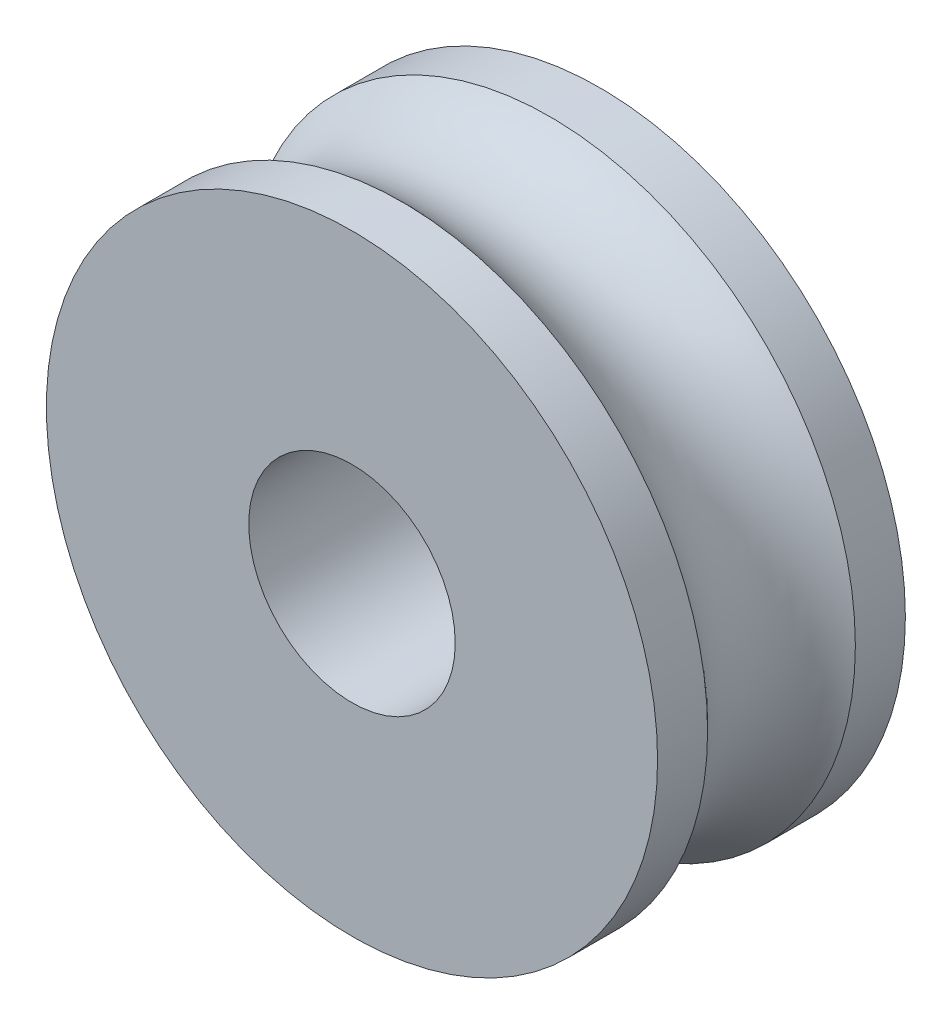
ISO-10303-21;
HEADER;
FILE_DESCRIPTION(('STEP AP214'),'2;1');
FILE_NAME('part.step','',(''),(''),'','','');
FILE_SCHEMA(('AUTOMOTIVE_DESIGN { 1 0 10303 214 1 1 1 1 }'));
ENDSEC;
DATA;
#1=APPLICATION_CONTEXT('core data for automotive mechanical design processes');
#2=APPLICATION_PROTOCOL_DEFINITION('international standard','automotive_design',2000,#1);
#3=PRODUCT_CONTEXT('',#1,'mechanical');
#4=PRODUCT('Part','Part','',(#3));
#5=PRODUCT_RELATED_PRODUCT_CATEGORY('part','',(#4));
#6=PRODUCT_DEFINITION_FORMATION('','',#4);
#7=PRODUCT_DEFINITION_CONTEXT('part definition',#1,'design');
#8=PRODUCT_DEFINITION('design','',#6,#7);
#9=PRODUCT_DEFINITION_SHAPE('','',#8);
#10=(LENGTH_UNIT() NAMED_UNIT(*) SI_UNIT(.MILLI.,.METRE.));
#11=(NAMED_UNIT(*) PLANE_ANGLE_UNIT() SI_UNIT($,.RADIAN.));
#12=(NAMED_UNIT(*) SI_UNIT($,.STERADIAN.) SOLID_ANGLE_UNIT());
#13=UNCERTAINTY_MEASURE_WITH_UNIT(LENGTH_MEASURE(1.E-05),#10,'distance_accuracy_value','');
#14=(GEOMETRIC_REPRESENTATION_CONTEXT(3) GLOBAL_UNCERTAINTY_ASSIGNED_CONTEXT((#13)) GLOBAL_UNIT_ASSIGNED_CONTEXT((#10,
#11,#12)) REPRESENTATION_CONTEXT('',''));
#15=CARTESIAN_POINT('',(0.,0.,0.));
#16=DIRECTION('',(0.,0.,1.));
#17=DIRECTION('',(1.,0.,0.));
#18=AXIS2_PLACEMENT_3D('',#15,#16,#17);
#19=CARTESIAN_POINT('',(0.,0.,0.));
#20=DIRECTION('',(0.,0.,1.));
#21=DIRECTION('',(1.,0.,0.));
#22=AXIS2_PLACEMENT_3D('',#19,#20,#21);
#23=CYLINDRICAL_SURFACE('',#22,37.);
#24=CARTESIAN_POINT('',(0.,0.,15.));
#25=DIRECTION('',(0.,0.,1.));
#26=DIRECTION('',(1.,0.,0.));
#27=AXIS2_PLACEMENT_3D('',#24,#25,#26);
#28=CIRCLE('',#27,37.);
#29=CARTESIAN_POINT('',(37.,0.,15.));
#30=VERTEX_POINT('',#29);
#31=EDGE_CURVE('E59',#30,#30,#28,.T.);
#32=ORIENTED_EDGE('',*,*,#31,.F.);
#33=EDGE_LOOP('',(#32));
#34=FACE_BOUND('',#33,.T.);
#35=CARTESIAN_POINT('',(0.,0.,8.94427190999915));
#36=DIRECTION('',(0.,0.,1.));
#37=DIRECTION('',(1.,0.,0.));
#38=AXIS2_PLACEMENT_3D('',#35,#36,#37);
#39=CIRCLE('',#38,37.);
#40=CARTESIAN_POINT('',(37.,0.,8.94427190999915));
#41=VERTEX_POINT('',#40);
#42=EDGE_CURVE('E10',#41,#41,#39,.T.);
#43=ORIENTED_EDGE('',*,*,#42,.T.);
#44=EDGE_LOOP('',(#43));
#45=FACE_BOUND('',#44,.T.);
#46=ADVANCED_FACE('F37',(#34,#45),#23,.T.);
#47=CARTESIAN_POINT('',(0.,0.,0.));
#48=DIRECTION('',(0.,0.,1.));
#49=DIRECTION('',(1.,0.,0.));
#50=AXIS2_PLACEMENT_3D('',#47,#48,#49);
#51=TOROIDAL_SURFACE('',#50,45.,12.);
#52=ORIENTED_EDGE('',*,*,#42,.F.);
#53=EDGE_LOOP('',(#52));
#54=FACE_BOUND('',#53,.T.);
#55=CARTESIAN_POINT('',(0.,0.,-8.94427190999915));
#56=DIRECTION('',(0.,0.,1.));
#57=DIRECTION('',(1.,0.,0.));
#58=AXIS2_PLACEMENT_3D('',#55,#56,#57);
#59=CIRCLE('',#58,37.);
#60=CARTESIAN_POINT('',(37.,0.,-8.94427190999915));
#61=VERTEX_POINT('',#60);
#62=EDGE_CURVE('E43',#61,#61,#59,.T.);
#63=ORIENTED_EDGE('',*,*,#62,.T.);
#64=EDGE_LOOP('',(#63));
#65=FACE_BOUND('',#64,.T.);
#66=ADVANCED_FACE('F66',(#54,#65),#51,.F.);
#67=CARTESIAN_POINT('',(0.,0.,0.));
#68=DIRECTION('',(0.,0.,1.));
#69=DIRECTION('',(1.,0.,0.));
#70=AXIS2_PLACEMENT_3D('',#67,#68,#69);
#71=CYLINDRICAL_SURFACE('',#70,37.);
#72=ORIENTED_EDGE('',*,*,#62,.F.);
#73=EDGE_LOOP('',(#72));
#74=FACE_BOUND('',#73,.T.);
#75=CARTESIAN_POINT('',(0.,0.,-15.));
#76=DIRECTION('',(0.,0.,1.));
#77=DIRECTION('',(1.,0.,0.));
#78=AXIS2_PLACEMENT_3D('',#75,#76,#77);
#79=CIRCLE('',#78,37.);
#80=CARTESIAN_POINT('',(37.,0.,-15.));
#81=VERTEX_POINT('',#80);
#82=EDGE_CURVE('E47',#81,#81,#79,.T.);
#83=ORIENTED_EDGE('',*,*,#82,.T.);
#84=EDGE_LOOP('',(#83));
#85=FACE_BOUND('',#84,.T.);
#86=ADVANCED_FACE('F70',(#74,#85),#71,.T.);
#87=CARTESIAN_POINT('',(0.,12.5,-15.));
#88=DIRECTION('',(0.,0.,1.));
#89=DIRECTION('',(1.,0.,0.));
#90=AXIS2_PLACEMENT_3D('',#87,#88,#89);
#91=PLANE('',#90);
#92=ORIENTED_EDGE('',*,*,#82,.F.);
#93=EDGE_LOOP('',(#92));
#94=FACE_BOUND('',#93,.T.);
#95=CARTESIAN_POINT('',(0.,0.,-15.));
#96=DIRECTION('',(0.,0.,1.));
#97=DIRECTION('',(1.,0.,0.));
#98=AXIS2_PLACEMENT_3D('',#95,#96,#97);
#99=CIRCLE('',#98,12.5);
#100=CARTESIAN_POINT('',(12.5,0.,-15.));
#101=VERTEX_POINT('',#100);
#102=EDGE_CURVE('E51',#101,#101,#99,.T.);
#103=ORIENTED_EDGE('',*,*,#102,.T.);
#104=EDGE_LOOP('',(#103));
#105=FACE_BOUND('',#104,.T.);
#106=ADVANCED_FACE('F75',(#94,#105),#91,.F.);
#107=CARTESIAN_POINT('',(0.,0.,0.));
#108=DIRECTION('',(0.,0.,1.));
#109=DIRECTION('',(1.,0.,0.));
#110=AXIS2_PLACEMENT_3D('',#107,#108,#109);
#111=CYLINDRICAL_SURFACE('',#110,12.5);
#112=ORIENTED_EDGE('',*,*,#102,.F.);
#113=EDGE_LOOP('',(#112));
#114=FACE_BOUND('',#113,.T.);
#115=CARTESIAN_POINT('',(0.,0.,15.));
#116=DIRECTION('',(0.,0.,1.));
#117=DIRECTION('',(1.,0.,0.));
#118=AXIS2_PLACEMENT_3D('',#115,#116,#117);
#119=CIRCLE('',#118,12.5);
#120=CARTESIAN_POINT('',(12.5,0.,15.));
#121=VERTEX_POINT('',#120);
#122=EDGE_CURVE('E56',#121,#121,#119,.T.);
#123=ORIENTED_EDGE('',*,*,#122,.T.);
#124=EDGE_LOOP('',(#123));
#125=FACE_BOUND('',#124,.T.);
#126=ADVANCED_FACE('F81',(#114,#125),#111,.F.);
#127=CARTESIAN_POINT('',(0.,12.5,15.));
#128=DIRECTION('',(0.,0.,-1.));
#129=DIRECTION('',(-1.,0.,0.));
#130=AXIS2_PLACEMENT_3D('',#127,#128,#129);
#131=PLANE('',#130);
#132=ORIENTED_EDGE('',*,*,#122,.F.);
#133=EDGE_LOOP('',(#132));
#134=FACE_BOUND('',#133,.T.);
#135=ORIENTED_EDGE('',*,*,#31,.T.);
#136=EDGE_LOOP('',(#135));
#137=FACE_BOUND('',#136,.T.);
#138=ADVANCED_FACE('F63',(#134,#137),#131,.F.);
#139=CLOSED_SHELL('',(#46,#66,#86,#106,#126,#138));
#140=MANIFOLD_SOLID_BREP('B2',#139);
#141=ADVANCED_BREP_SHAPE_REPRESENTATION('',(#18,#140),#14);
#142=SHAPE_DEFINITION_REPRESENTATION(#9,#141);
ENDSEC;
END-ISO-10303-21;
